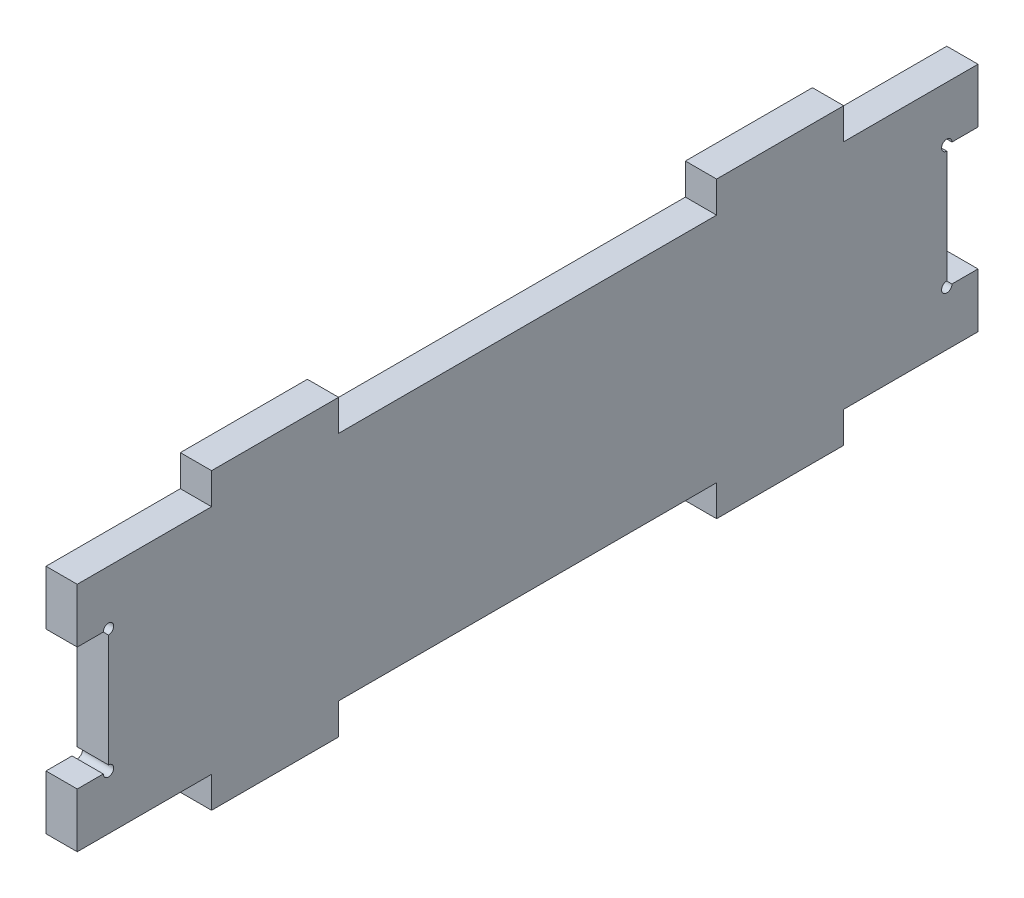
ISO-10303-21;
HEADER;
FILE_DESCRIPTION(('STEP AP214'),'2;1');
FILE_NAME('part.step','',(''),(''),'','','');
FILE_SCHEMA(('AUTOMOTIVE_DESIGN { 1 0 10303 214 1 1 1 1 }'));
ENDSEC;
DATA;
#1=APPLICATION_CONTEXT('core data for automotive mechanical design processes');
#2=APPLICATION_PROTOCOL_DEFINITION('international standard','automotive_design',2000,#1);
#3=PRODUCT_CONTEXT('',#1,'mechanical');
#4=PRODUCT('Part','Part','',(#3));
#5=PRODUCT_RELATED_PRODUCT_CATEGORY('part','',(#4));
#6=PRODUCT_DEFINITION_FORMATION('','',#4);
#7=PRODUCT_DEFINITION_CONTEXT('part definition',#1,'design');
#8=PRODUCT_DEFINITION('design','',#6,#7);
#9=PRODUCT_DEFINITION_SHAPE('','',#8);
#10=(LENGTH_UNIT() NAMED_UNIT(*) SI_UNIT(.MILLI.,.METRE.));
#11=(NAMED_UNIT(*) PLANE_ANGLE_UNIT() SI_UNIT($,.RADIAN.));
#12=(NAMED_UNIT(*) SI_UNIT($,.STERADIAN.) SOLID_ANGLE_UNIT());
#13=UNCERTAINTY_MEASURE_WITH_UNIT(LENGTH_MEASURE(1.E-05),#10,'distance_accuracy_value','');
#14=(GEOMETRIC_REPRESENTATION_CONTEXT(3) GLOBAL_UNCERTAINTY_ASSIGNED_CONTEXT((#13)) GLOBAL_UNIT_ASSIGNED_CONTEXT((#10,
#11,#12)) REPRESENTATION_CONTEXT('',''));
#15=CARTESIAN_POINT('',(0.,0.,0.));
#16=DIRECTION('',(0.,0.,1.));
#17=DIRECTION('',(1.,0.,0.));
#18=AXIS2_PLACEMENT_3D('',#15,#16,#17);
#19=CARTESIAN_POINT('',(3.,20.0947082124793,-0.14299932326039));
#20=DIRECTION('',(0.,1.,0.));
#21=DIRECTION('',(0.,0.,1.));
#22=AXIS2_PLACEMENT_3D('',#19,#20,#21);
#23=PLANE('',#22);
#24=DIRECTION('',(0.,0.,-1.));
#25=VECTOR('',#24,1.);
#26=CARTESIAN_POINT('',(0.,20.0947082124793,-0.14299932326039));
#27=LINE('',#26,#25);
#28=CARTESIAN_POINT('',(0.,20.0947082124793,-0.14299932326039));
#29=VERTEX_POINT('',#28);
#30=CARTESIAN_POINT('',(0.,20.0947082124793,-2.64299932326039));
#31=VERTEX_POINT('',#30);
#32=EDGE_CURVE('E272',#29,#31,#27,.T.);
#33=ORIENTED_EDGE('',*,*,#32,.T.);
#34=DIRECTION('',(-1.,0.,0.));
#35=VECTOR('',#34,1.);
#36=CARTESIAN_POINT('',(3.,20.0947082124793,-2.64299932326039));
#37=LINE('',#36,#35);
#38=CARTESIAN_POINT('',(3.,20.0947082124793,-2.64299932326039));
#39=VERTEX_POINT('',#38);
#40=EDGE_CURVE('E11',#39,#31,#37,.T.);
#41=ORIENTED_EDGE('',*,*,#40,.F.);
#42=DIRECTION('',(0.,0.,-1.));
#43=VECTOR('',#42,1.);
#44=CARTESIAN_POINT('',(3.,20.0947082124793,-0.14299932326039));
#45=LINE('',#44,#43);
#46=CARTESIAN_POINT('',(3.,20.0947082124793,-0.14299932326039));
#47=VERTEX_POINT('',#46);
#48=EDGE_CURVE('E334',#47,#39,#45,.T.);
#49=ORIENTED_EDGE('',*,*,#48,.F.);
#50=DIRECTION('',(-1.,0.,0.));
#51=VECTOR('',#50,1.);
#52=CARTESIAN_POINT('',(3.,20.0947082124793,-0.14299932326039));
#53=LINE('',#52,#51);
#54=EDGE_CURVE('E268',#47,#29,#53,.T.);
#55=ORIENTED_EDGE('',*,*,#54,.T.);
#56=EDGE_LOOP('',(#33,#41,#49,#55));
#57=FACE_BOUND('',#56,.T.);
#58=ADVANCED_FACE('F32',(#57),#23,.F.);
#59=CARTESIAN_POINT('',(3.,20.0947082124793,-3.14299932326039));
#60=DIRECTION('',(-1.,0.,0.));
#61=DIRECTION('',(0.,0.,1.));
#62=AXIS2_PLACEMENT_3D('',#59,#60,#61);
#63=CYLINDRICAL_SURFACE('',#62,0.5);
#64=CARTESIAN_POINT('',(0.,20.0947082124793,-3.14299932326039));
#65=DIRECTION('',(-1.,0.,0.));
#66=DIRECTION('',(0.,0.,-1.));
#67=AXIS2_PLACEMENT_3D('',#64,#65,#66);
#68=CIRCLE('',#67,0.5);
#69=CARTESIAN_POINT('',(0.,19.5947082124793,-3.14299932326039));
#70=VERTEX_POINT('',#69);
#71=EDGE_CURVE('E275',#31,#70,#68,.T.);
#72=ORIENTED_EDGE('',*,*,#71,.T.);
#73=DIRECTION('',(-1.,0.,0.));
#74=VECTOR('',#73,1.);
#75=CARTESIAN_POINT('',(3.,19.5947082124793,-3.14299932326039));
#76=LINE('',#75,#74);
#77=CARTESIAN_POINT('',(3.,19.5947082124793,-3.14299932326039));
#78=VERTEX_POINT('',#77);
#79=EDGE_CURVE('E40',#78,#70,#76,.T.);
#80=ORIENTED_EDGE('',*,*,#79,.F.);
#81=CARTESIAN_POINT('',(3.,20.0947082124793,-3.14299932326039));
#82=DIRECTION('',(-1.,0.,0.));
#83=DIRECTION('',(0.,0.,-1.));
#84=AXIS2_PLACEMENT_3D('',#81,#82,#83);
#85=CIRCLE('',#84,0.5);
#86=EDGE_CURVE('E163',#39,#78,#85,.T.);
#87=ORIENTED_EDGE('',*,*,#86,.F.);
#88=ORIENTED_EDGE('',*,*,#40,.T.);
#89=EDGE_LOOP('',(#72,#80,#87,#88));
#90=FACE_BOUND('',#89,.T.);
#91=ADVANCED_FACE('F512',(#90),#63,.F.);
#92=CARTESIAN_POINT('',(3.,19.5947082124793,-3.14299932326039));
#93=DIRECTION('',(0.,0.,-1.));
#94=DIRECTION('',(0.,1.,0.));
#95=AXIS2_PLACEMENT_3D('',#92,#93,#94);
#96=PLANE('',#95);
#97=DIRECTION('',(0.,-1.,0.));
#98=VECTOR('',#97,1.);
#99=CARTESIAN_POINT('',(0.,19.5947082124793,-3.14299932326039));
#100=LINE('',#99,#98);
#101=CARTESIAN_POINT('',(0.,8.79470821247926,-3.14299932326039));
#102=VERTEX_POINT('',#101);
#103=EDGE_CURVE('E277',#70,#102,#100,.T.);
#104=ORIENTED_EDGE('',*,*,#103,.T.);
#105=DIRECTION('',(-1.,0.,0.));
#106=VECTOR('',#105,1.);
#107=CARTESIAN_POINT('',(3.,8.79470821247926,-3.14299932326039));
#108=LINE('',#107,#106);
#109=CARTESIAN_POINT('',(3.,8.79470821247926,-3.14299932326039));
#110=VERTEX_POINT('',#109);
#111=EDGE_CURVE('E413',#110,#102,#108,.T.);
#112=ORIENTED_EDGE('',*,*,#111,.F.);
#113=DIRECTION('',(0.,-1.,0.));
#114=VECTOR('',#113,1.);
#115=CARTESIAN_POINT('',(3.,19.5947082124793,-3.14299932326039));
#116=LINE('',#115,#114);
#117=EDGE_CURVE('E421',#78,#110,#116,.T.);
#118=ORIENTED_EDGE('',*,*,#117,.F.);
#119=ORIENTED_EDGE('',*,*,#79,.T.);
#120=EDGE_LOOP('',(#104,#112,#118,#119));
#121=FACE_BOUND('',#120,.T.);
#122=ADVANCED_FACE('F419',(#121),#96,.F.);
#123=CARTESIAN_POINT('',(3.,8.29470821247925,-3.14299932326039));
#124=DIRECTION('',(-1.,0.,0.));
#125=DIRECTION('',(0.,0.,1.));
#126=AXIS2_PLACEMENT_3D('',#123,#124,#125);
#127=CYLINDRICAL_SURFACE('',#126,0.5);
#128=CARTESIAN_POINT('',(0.,8.29470821247925,-3.14299932326039));
#129=DIRECTION('',(-1.,0.,0.));
#130=DIRECTION('',(0.,0.,-1.));
#131=AXIS2_PLACEMENT_3D('',#128,#129,#130);
#132=CIRCLE('',#131,0.5);
#133=CARTESIAN_POINT('',(0.,8.29470821247925,-2.64299932326039));
#134=VERTEX_POINT('',#133);
#135=EDGE_CURVE('E279',#102,#134,#132,.T.);
#136=ORIENTED_EDGE('',*,*,#135,.T.);
#137=DIRECTION('',(-1.,0.,0.));
#138=VECTOR('',#137,1.);
#139=CARTESIAN_POINT('',(3.,8.29470821247925,-2.64299932326039));
#140=LINE('',#139,#138);
#141=CARTESIAN_POINT('',(3.,8.29470821247925,-2.64299932326039));
#142=VERTEX_POINT('',#141);
#143=EDGE_CURVE('E410',#142,#134,#140,.T.);
#144=ORIENTED_EDGE('',*,*,#143,.F.);
#145=CARTESIAN_POINT('',(3.,8.29470821247925,-3.14299932326039));
#146=DIRECTION('',(-1.,0.,0.));
#147=DIRECTION('',(0.,0.,-1.));
#148=AXIS2_PLACEMENT_3D('',#145,#146,#147);
#149=CIRCLE('',#148,0.5);
#150=EDGE_CURVE('E439',#110,#142,#149,.T.);
#151=ORIENTED_EDGE('',*,*,#150,.F.);
#152=ORIENTED_EDGE('',*,*,#111,.T.);
#153=EDGE_LOOP('',(#136,#144,#151,#152));
#154=FACE_BOUND('',#153,.T.);
#155=ADVANCED_FACE('F430',(#154),#127,.F.);
#156=CARTESIAN_POINT('',(3.,8.29470821247925,-0.14299932326039));
#157=DIRECTION('',(0.,-1.,0.));
#158=DIRECTION('',(0.,0.,-1.));
#159=AXIS2_PLACEMENT_3D('',#156,#157,#158);
#160=PLANE('',#159);
#161=DIRECTION('',(0.,0.,1.));
#162=VECTOR('',#161,1.);
#163=CARTESIAN_POINT('',(0.,8.29470821247925,-0.14299932326039));
#164=LINE('',#163,#162);
#165=CARTESIAN_POINT('',(0.,8.29470821247925,-0.14299932326039));
#166=VERTEX_POINT('',#165);
#167=EDGE_CURVE('E281',#134,#166,#164,.T.);
#168=ORIENTED_EDGE('',*,*,#167,.T.);
#169=DIRECTION('',(-1.,0.,0.));
#170=VECTOR('',#169,1.);
#171=CARTESIAN_POINT('',(3.,8.29470821247925,-0.14299932326039));
#172=LINE('',#171,#170);
#173=CARTESIAN_POINT('',(3.,8.29470821247925,-0.14299932326039));
#174=VERTEX_POINT('',#173);
#175=EDGE_CURVE('E407',#174,#166,#172,.T.);
#176=ORIENTED_EDGE('',*,*,#175,.F.);
#177=DIRECTION('',(0.,0.,1.));
#178=VECTOR('',#177,1.);
#179=CARTESIAN_POINT('',(3.,8.29470821247925,-0.14299932326039));
#180=LINE('',#179,#178);
#181=EDGE_CURVE('E436',#142,#174,#180,.T.);
#182=ORIENTED_EDGE('',*,*,#181,.F.);
#183=ORIENTED_EDGE('',*,*,#143,.T.);
#184=EDGE_LOOP('',(#168,#176,#182,#183));
#185=FACE_BOUND('',#184,.T.);
#186=ADVANCED_FACE('F434',(#185),#160,.F.);
#187=CARTESIAN_POINT('',(3.,3.06970821247926,-0.14299932326039));
#188=DIRECTION('',(0.,0.,-1.));
#189=DIRECTION('',(-1.,0.,0.));
#190=AXIS2_PLACEMENT_3D('',#187,#188,#189);
#191=PLANE('',#190);
#192=DIRECTION('',(0.,-1.,0.));
#193=VECTOR('',#192,1.);
#194=CARTESIAN_POINT('',(0.,3.06970821247926,-0.14299932326039));
#195=LINE('',#194,#193);
#196=CARTESIAN_POINT('',(0.,3.06970821247926,-0.14299932326039));
#197=VERTEX_POINT('',#196);
#198=EDGE_CURVE('E283',#166,#197,#195,.T.);
#199=ORIENTED_EDGE('',*,*,#198,.T.);
#200=DIRECTION('',(-1.,0.,0.));
#201=VECTOR('',#200,1.);
#202=CARTESIAN_POINT('',(3.,3.06970821247926,-0.14299932326039));
#203=LINE('',#202,#201);
#204=CARTESIAN_POINT('',(3.,3.06970821247926,-0.14299932326039));
#205=VERTEX_POINT('',#204);
#206=EDGE_CURVE('E404',#205,#197,#203,.T.);
#207=ORIENTED_EDGE('',*,*,#206,.F.);
#208=DIRECTION('',(0.,-1.,0.));
#209=VECTOR('',#208,1.);
#210=CARTESIAN_POINT('',(3.,3.06970821247926,-0.14299932326039));
#211=LINE('',#210,#209);
#212=EDGE_CURVE('E438',#174,#205,#211,.T.);
#213=ORIENTED_EDGE('',*,*,#212,.F.);
#214=ORIENTED_EDGE('',*,*,#175,.T.);
#215=EDGE_LOOP('',(#199,#207,#213,#214));
#216=FACE_BOUND('',#215,.T.);
#217=ADVANCED_FACE('F525',(#216),#191,.F.);
#218=CARTESIAN_POINT('',(3.,3.06970821247926,-0.14299932326039));
#219=DIRECTION('',(0.,1.,0.));
#220=DIRECTION('',(0.,0.,1.));
#221=AXIS2_PLACEMENT_3D('',#218,#219,#220);
#222=PLANE('',#221);
#223=DIRECTION('',(0.,0.,-1.));
#224=VECTOR('',#223,1.);
#225=CARTESIAN_POINT('',(0.,3.06970821247926,-0.14299932326039));
#226=LINE('',#225,#224);
#227=CARTESIAN_POINT('',(0.,3.06970821247926,-13.0429993232604));
#228=VERTEX_POINT('',#227);
#229=EDGE_CURVE('E285',#197,#228,#226,.T.);
#230=ORIENTED_EDGE('',*,*,#229,.T.);
#231=DIRECTION('',(-1.,0.,0.));
#232=VECTOR('',#231,1.);
#233=CARTESIAN_POINT('',(3.,3.06970821247926,-13.0429993232604));
#234=LINE('',#233,#232);
#235=CARTESIAN_POINT('',(3.,3.06970821247926,-13.0429993232604));
#236=VERTEX_POINT('',#235);
#237=EDGE_CURVE('E401',#236,#228,#234,.T.);
#238=ORIENTED_EDGE('',*,*,#237,.F.);
#239=DIRECTION('',(0.,0.,-1.));
#240=VECTOR('',#239,1.);
#241=CARTESIAN_POINT('',(3.,3.06970821247926,-0.14299932326039));
#242=LINE('',#241,#240);
#243=EDGE_CURVE('E441',#205,#236,#242,.T.);
#244=ORIENTED_EDGE('',*,*,#243,.F.);
#245=ORIENTED_EDGE('',*,*,#206,.T.);
#246=EDGE_LOOP('',(#230,#238,#244,#245));
#247=FACE_BOUND('',#246,.T.);
#248=ADVANCED_FACE('F528',(#247),#222,.F.);
#249=CARTESIAN_POINT('',(3.,3.06970821247926,-13.0429993232604));
#250=DIRECTION('',(0.,0.,-1.));
#251=DIRECTION('',(-1.,0.,0.));
#252=AXIS2_PLACEMENT_3D('',#249,#250,#251);
#253=PLANE('',#252);
#254=DIRECTION('',(0.,-1.,0.));
#255=VECTOR('',#254,1.);
#256=CARTESIAN_POINT('',(0.,3.06970821247926,-13.0429993232604));
#257=LINE('',#256,#255);
#258=CARTESIAN_POINT('',(0.,0.0697082124792581,-13.0429993232604));
#259=VERTEX_POINT('',#258);
#260=EDGE_CURVE('E287',#228,#259,#257,.T.);
#261=ORIENTED_EDGE('',*,*,#260,.T.);
#262=DIRECTION('',(-1.,0.,0.));
#263=VECTOR('',#262,1.);
#264=CARTESIAN_POINT('',(3.,0.0697082124792581,-13.0429993232604));
#265=LINE('',#264,#263);
#266=CARTESIAN_POINT('',(3.,0.0697082124792581,-13.0429993232604));
#267=VERTEX_POINT('',#266);
#268=EDGE_CURVE('E398',#267,#259,#265,.T.);
#269=ORIENTED_EDGE('',*,*,#268,.F.);
#270=DIRECTION('',(0.,-1.,0.));
#271=VECTOR('',#270,1.);
#272=CARTESIAN_POINT('',(3.,3.06970821247926,-13.0429993232604));
#273=LINE('',#272,#271);
#274=EDGE_CURVE('E447',#236,#267,#273,.T.);
#275=ORIENTED_EDGE('',*,*,#274,.F.);
#276=ORIENTED_EDGE('',*,*,#237,.T.);
#277=EDGE_LOOP('',(#261,#269,#275,#276));
#278=FACE_BOUND('',#277,.T.);
#279=ADVANCED_FACE('F532',(#278),#253,.F.);
#280=CARTESIAN_POINT('',(3.,0.0697082124792581,-13.0429993232604));
#281=DIRECTION('',(0.,1.,0.));
#282=DIRECTION('',(0.,0.,1.));
#283=AXIS2_PLACEMENT_3D('',#280,#281,#282);
#284=PLANE('',#283);
#285=DIRECTION('',(0.,0.,-1.));
#286=VECTOR('',#285,1.);
#287=CARTESIAN_POINT('',(0.,0.0697082124792581,-13.0429993232604));
#288=LINE('',#287,#286);
#289=CARTESIAN_POINT('',(0.,0.069708212479258,-25.2429993232604));
#290=VERTEX_POINT('',#289);
#291=EDGE_CURVE('E289',#259,#290,#288,.T.);
#292=ORIENTED_EDGE('',*,*,#291,.T.);
#293=DIRECTION('',(-1.,0.,0.));
#294=VECTOR('',#293,1.);
#295=CARTESIAN_POINT('',(3.,0.069708212479258,-25.2429993232604));
#296=LINE('',#295,#294);
#297=CARTESIAN_POINT('',(3.,0.069708212479258,-25.2429993232604));
#298=VERTEX_POINT('',#297);
#299=EDGE_CURVE('E395',#298,#290,#296,.T.);
#300=ORIENTED_EDGE('',*,*,#299,.F.);
#301=DIRECTION('',(0.,0.,-1.));
#302=VECTOR('',#301,1.);
#303=CARTESIAN_POINT('',(3.,0.0697082124792581,-13.0429993232604));
#304=LINE('',#303,#302);
#305=EDGE_CURVE('E449',#267,#298,#304,.T.);
#306=ORIENTED_EDGE('',*,*,#305,.F.);
#307=ORIENTED_EDGE('',*,*,#268,.T.);
#308=EDGE_LOOP('',(#292,#300,#306,#307));
#309=FACE_BOUND('',#308,.T.);
#310=ADVANCED_FACE('F536',(#309),#284,.F.);
#311=CARTESIAN_POINT('',(3.,3.06970821247926,-25.2429993232604));
#312=DIRECTION('',(0.,0.,1.));
#313=DIRECTION('',(1.,0.,0.));
#314=AXIS2_PLACEMENT_3D('',#311,#312,#313);
#315=PLANE('',#314);
#316=DIRECTION('',(0.,1.,0.));
#317=VECTOR('',#316,1.);
#318=CARTESIAN_POINT('',(0.,3.06970821247926,-25.2429993232604));
#319=LINE('',#318,#317);
#320=CARTESIAN_POINT('',(0.,3.06970821247926,-25.2429993232604));
#321=VERTEX_POINT('',#320);
#322=EDGE_CURVE('E291',#290,#321,#319,.T.);
#323=ORIENTED_EDGE('',*,*,#322,.T.);
#324=DIRECTION('',(-1.,0.,0.));
#325=VECTOR('',#324,1.);
#326=CARTESIAN_POINT('',(3.,3.06970821247926,-25.2429993232604));
#327=LINE('',#326,#325);
#328=CARTESIAN_POINT('',(3.,3.06970821247926,-25.2429993232604));
#329=VERTEX_POINT('',#328);
#330=EDGE_CURVE('E392',#329,#321,#327,.T.);
#331=ORIENTED_EDGE('',*,*,#330,.F.);
#332=DIRECTION('',(0.,1.,0.));
#333=VECTOR('',#332,1.);
#334=CARTESIAN_POINT('',(3.,3.06970821247926,-25.2429993232604));
#335=LINE('',#334,#333);
#336=EDGE_CURVE('E451',#298,#329,#335,.T.);
#337=ORIENTED_EDGE('',*,*,#336,.F.);
#338=ORIENTED_EDGE('',*,*,#299,.T.);
#339=EDGE_LOOP('',(#323,#331,#337,#338));
#340=FACE_BOUND('',#339,.T.);
#341=ADVANCED_FACE('F540',(#340),#315,.F.);
#342=CARTESIAN_POINT('',(3.,3.06970821247926,-25.2429993232604));
#343=DIRECTION('',(0.,1.,0.));
#344=DIRECTION('',(0.,0.,1.));
#345=AXIS2_PLACEMENT_3D('',#342,#343,#344);
#346=PLANE('',#345);
#347=DIRECTION('',(0.,0.,-1.));
#348=VECTOR('',#347,1.);
#349=CARTESIAN_POINT('',(0.,3.06970821247926,-25.2429993232604));
#350=LINE('',#349,#348);
#351=CARTESIAN_POINT('',(0.,3.06970821247926,-61.5429993232604));
#352=VERTEX_POINT('',#351);
#353=EDGE_CURVE('E293',#321,#352,#350,.T.);
#354=ORIENTED_EDGE('',*,*,#353,.T.);
#355=DIRECTION('',(-1.,0.,0.));
#356=VECTOR('',#355,1.);
#357=CARTESIAN_POINT('',(3.,3.06970821247926,-61.5429993232604));
#358=LINE('',#357,#356);
#359=CARTESIAN_POINT('',(3.,3.06970821247926,-61.5429993232604));
#360=VERTEX_POINT('',#359);
#361=EDGE_CURVE('E389',#360,#352,#358,.T.);
#362=ORIENTED_EDGE('',*,*,#361,.F.);
#363=DIRECTION('',(0.,0.,-1.));
#364=VECTOR('',#363,1.);
#365=CARTESIAN_POINT('',(3.,3.06970821247926,-25.2429993232604));
#366=LINE('',#365,#364);
#367=EDGE_CURVE('E453',#329,#360,#366,.T.);
#368=ORIENTED_EDGE('',*,*,#367,.F.);
#369=ORIENTED_EDGE('',*,*,#330,.T.);
#370=EDGE_LOOP('',(#354,#362,#368,#369));
#371=FACE_BOUND('',#370,.T.);
#372=ADVANCED_FACE('F544',(#371),#346,.F.);
#373=CARTESIAN_POINT('',(3.,3.06970821247926,-61.5429993232604));
#374=DIRECTION('',(0.,0.,-1.));
#375=DIRECTION('',(-1.,0.,0.));
#376=AXIS2_PLACEMENT_3D('',#373,#374,#375);
#377=PLANE('',#376);
#378=DIRECTION('',(0.,-1.,0.));
#379=VECTOR('',#378,1.);
#380=CARTESIAN_POINT('',(0.,3.06970821247926,-61.5429993232604));
#381=LINE('',#380,#379);
#382=CARTESIAN_POINT('',(0.,0.0697082124792581,-61.5429993232604));
#383=VERTEX_POINT('',#382);
#384=EDGE_CURVE('E295',#352,#383,#381,.T.);
#385=ORIENTED_EDGE('',*,*,#384,.T.);
#386=DIRECTION('',(-1.,0.,0.));
#387=VECTOR('',#386,1.);
#388=CARTESIAN_POINT('',(3.,0.0697082124792581,-61.5429993232604));
#389=LINE('',#388,#387);
#390=CARTESIAN_POINT('',(3.,0.0697082124792581,-61.5429993232604));
#391=VERTEX_POINT('',#390);
#392=EDGE_CURVE('E386',#391,#383,#389,.T.);
#393=ORIENTED_EDGE('',*,*,#392,.F.);
#394=DIRECTION('',(0.,-1.,0.));
#395=VECTOR('',#394,1.);
#396=CARTESIAN_POINT('',(3.,3.06970821247926,-61.5429993232604));
#397=LINE('',#396,#395);
#398=EDGE_CURVE('E455',#360,#391,#397,.T.);
#399=ORIENTED_EDGE('',*,*,#398,.F.);
#400=ORIENTED_EDGE('',*,*,#361,.T.);
#401=EDGE_LOOP('',(#385,#393,#399,#400));
#402=FACE_BOUND('',#401,.T.);
#403=ADVANCED_FACE('F548',(#402),#377,.F.);
#404=CARTESIAN_POINT('',(3.,0.0697082124792581,-61.5429993232604));
#405=DIRECTION('',(0.,1.,0.));
#406=DIRECTION('',(0.,0.,1.));
#407=AXIS2_PLACEMENT_3D('',#404,#405,#406);
#408=PLANE('',#407);
#409=DIRECTION('',(0.,0.,-1.));
#410=VECTOR('',#409,1.);
#411=CARTESIAN_POINT('',(0.,0.0697082124792581,-61.5429993232604));
#412=LINE('',#411,#410);
#413=CARTESIAN_POINT('',(0.,0.0697082124792581,-73.7429993232604));
#414=VERTEX_POINT('',#413);
#415=EDGE_CURVE('E297',#383,#414,#412,.T.);
#416=ORIENTED_EDGE('',*,*,#415,.T.);
#417=DIRECTION('',(-1.,0.,0.));
#418=VECTOR('',#417,1.);
#419=CARTESIAN_POINT('',(3.,0.0697082124792581,-73.7429993232604));
#420=LINE('',#419,#418);
#421=CARTESIAN_POINT('',(3.,0.0697082124792581,-73.7429993232604));
#422=VERTEX_POINT('',#421);
#423=EDGE_CURVE('E383',#422,#414,#420,.T.);
#424=ORIENTED_EDGE('',*,*,#423,.F.);
#425=DIRECTION('',(0.,0.,-1.));
#426=VECTOR('',#425,1.);
#427=CARTESIAN_POINT('',(3.,0.0697082124792581,-61.5429993232604));
#428=LINE('',#427,#426);
#429=EDGE_CURVE('E457',#391,#422,#428,.T.);
#430=ORIENTED_EDGE('',*,*,#429,.F.);
#431=ORIENTED_EDGE('',*,*,#392,.T.);
#432=EDGE_LOOP('',(#416,#424,#430,#431));
#433=FACE_BOUND('',#432,.T.);
#434=ADVANCED_FACE('F552',(#433),#408,.F.);
#435=CARTESIAN_POINT('',(3.,3.06970821247926,-73.7429993232604));
#436=DIRECTION('',(0.,0.,1.));
#437=DIRECTION('',(1.,0.,0.));
#438=AXIS2_PLACEMENT_3D('',#435,#436,#437);
#439=PLANE('',#438);
#440=DIRECTION('',(0.,1.,0.));
#441=VECTOR('',#440,1.);
#442=CARTESIAN_POINT('',(0.,3.06970821247926,-73.7429993232604));
#443=LINE('',#442,#441);
#444=CARTESIAN_POINT('',(0.,3.06970821247926,-73.7429993232604));
#445=VERTEX_POINT('',#444);
#446=EDGE_CURVE('E299',#414,#445,#443,.T.);
#447=ORIENTED_EDGE('',*,*,#446,.T.);
#448=DIRECTION('',(-1.,0.,0.));
#449=VECTOR('',#448,1.);
#450=CARTESIAN_POINT('',(3.,3.06970821247926,-73.7429993232604));
#451=LINE('',#450,#449);
#452=CARTESIAN_POINT('',(3.,3.06970821247926,-73.7429993232604));
#453=VERTEX_POINT('',#452);
#454=EDGE_CURVE('E380',#453,#445,#451,.T.);
#455=ORIENTED_EDGE('',*,*,#454,.F.);
#456=DIRECTION('',(0.,1.,0.));
#457=VECTOR('',#456,1.);
#458=CARTESIAN_POINT('',(3.,3.06970821247926,-73.7429993232604));
#459=LINE('',#458,#457);
#460=EDGE_CURVE('E459',#422,#453,#459,.T.);
#461=ORIENTED_EDGE('',*,*,#460,.F.);
#462=ORIENTED_EDGE('',*,*,#423,.T.);
#463=EDGE_LOOP('',(#447,#455,#461,#462));
#464=FACE_BOUND('',#463,.T.);
#465=ADVANCED_FACE('F556',(#464),#439,.F.);
#466=CARTESIAN_POINT('',(3.,3.06970821247926,-73.7429993232604));
#467=DIRECTION('',(0.,1.,0.));
#468=DIRECTION('',(0.,0.,1.));
#469=AXIS2_PLACEMENT_3D('',#466,#467,#468);
#470=PLANE('',#469);
#471=DIRECTION('',(0.,0.,-1.));
#472=VECTOR('',#471,1.);
#473=CARTESIAN_POINT('',(0.,3.06970821247926,-73.7429993232604));
#474=LINE('',#473,#472);
#475=CARTESIAN_POINT('',(0.,3.06970821247926,-86.6429993232604));
#476=VERTEX_POINT('',#475);
#477=EDGE_CURVE('E301',#445,#476,#474,.T.);
#478=ORIENTED_EDGE('',*,*,#477,.T.);
#479=DIRECTION('',(-1.,0.,0.));
#480=VECTOR('',#479,1.);
#481=CARTESIAN_POINT('',(3.,3.06970821247926,-86.6429993232604));
#482=LINE('',#481,#480);
#483=CARTESIAN_POINT('',(3.,3.06970821247926,-86.6429993232604));
#484=VERTEX_POINT('',#483);
#485=EDGE_CURVE('E377',#484,#476,#482,.T.);
#486=ORIENTED_EDGE('',*,*,#485,.F.);
#487=DIRECTION('',(0.,0.,-1.));
#488=VECTOR('',#487,1.);
#489=CARTESIAN_POINT('',(3.,3.06970821247926,-73.7429993232604));
#490=LINE('',#489,#488);
#491=EDGE_CURVE('E461',#453,#484,#490,.T.);
#492=ORIENTED_EDGE('',*,*,#491,.F.);
#493=ORIENTED_EDGE('',*,*,#454,.T.);
#494=EDGE_LOOP('',(#478,#486,#492,#493));
#495=FACE_BOUND('',#494,.T.);
#496=ADVANCED_FACE('F560',(#495),#470,.F.);
#497=CARTESIAN_POINT('',(3.,3.06970821247926,-86.6429993232604));
#498=DIRECTION('',(0.,0.,1.));
#499=DIRECTION('',(1.,0.,0.));
#500=AXIS2_PLACEMENT_3D('',#497,#498,#499);
#501=PLANE('',#500);
#502=DIRECTION('',(0.,1.,0.));
#503=VECTOR('',#502,1.);
#504=CARTESIAN_POINT('',(0.,3.06970821247926,-86.6429993232604));
#505=LINE('',#504,#503);
#506=CARTESIAN_POINT('',(0.,8.29470821247925,-86.6429993232604));
#507=VERTEX_POINT('',#506);
#508=EDGE_CURVE('E303',#476,#507,#505,.T.);
#509=ORIENTED_EDGE('',*,*,#508,.T.);
#510=DIRECTION('',(-1.,0.,0.));
#511=VECTOR('',#510,1.);
#512=CARTESIAN_POINT('',(3.,8.29470821247925,-86.6429993232604));
#513=LINE('',#512,#511);
#514=CARTESIAN_POINT('',(3.,8.29470821247925,-86.6429993232604));
#515=VERTEX_POINT('',#514);
#516=EDGE_CURVE('E374',#515,#507,#513,.T.);
#517=ORIENTED_EDGE('',*,*,#516,.F.);
#518=DIRECTION('',(0.,1.,0.));
#519=VECTOR('',#518,1.);
#520=CARTESIAN_POINT('',(3.,3.06970821247926,-86.6429993232604));
#521=LINE('',#520,#519);
#522=EDGE_CURVE('E463',#484,#515,#521,.T.);
#523=ORIENTED_EDGE('',*,*,#522,.F.);
#524=ORIENTED_EDGE('',*,*,#485,.T.);
#525=EDGE_LOOP('',(#509,#517,#523,#524));
#526=FACE_BOUND('',#525,.T.);
#527=ADVANCED_FACE('F564',(#526),#501,.F.);
#528=CARTESIAN_POINT('',(3.,8.29470821247925,-86.6429993232604));
#529=DIRECTION('',(0.,-1.,0.));
#530=DIRECTION('',(0.,0.,-1.));
#531=AXIS2_PLACEMENT_3D('',#528,#529,#530);
#532=PLANE('',#531);
#533=DIRECTION('',(0.,0.,1.));
#534=VECTOR('',#533,1.);
#535=CARTESIAN_POINT('',(0.,8.29470821247925,-86.6429993232604));
#536=LINE('',#535,#534);
#537=CARTESIAN_POINT('',(0.,8.29470821247925,-84.1429993232604));
#538=VERTEX_POINT('',#537);
#539=EDGE_CURVE('E305',#507,#538,#536,.T.);
#540=ORIENTED_EDGE('',*,*,#539,.T.);
#541=DIRECTION('',(-1.,0.,0.));
#542=VECTOR('',#541,1.);
#543=CARTESIAN_POINT('',(3.,8.29470821247925,-84.1429993232604));
#544=LINE('',#543,#542);
#545=CARTESIAN_POINT('',(3.,8.29470821247925,-84.1429993232604));
#546=VERTEX_POINT('',#545);
#547=EDGE_CURVE('E371',#546,#538,#544,.T.);
#548=ORIENTED_EDGE('',*,*,#547,.F.);
#549=DIRECTION('',(0.,0.,1.));
#550=VECTOR('',#549,1.);
#551=CARTESIAN_POINT('',(3.,8.29470821247925,-86.6429993232604));
#552=LINE('',#551,#550);
#553=EDGE_CURVE('E465',#515,#546,#552,.T.);
#554=ORIENTED_EDGE('',*,*,#553,.F.);
#555=ORIENTED_EDGE('',*,*,#516,.T.);
#556=EDGE_LOOP('',(#540,#548,#554,#555));
#557=FACE_BOUND('',#556,.T.);
#558=ADVANCED_FACE('F568',(#557),#532,.F.);
#559=CARTESIAN_POINT('',(3.,8.29470821247925,-83.6429993232604));
#560=DIRECTION('',(-1.,0.,0.));
#561=DIRECTION('',(0.,0.,1.));
#562=AXIS2_PLACEMENT_3D('',#559,#560,#561);
#563=CYLINDRICAL_SURFACE('',#562,0.5);
#564=CARTESIAN_POINT('',(0.,8.29470821247925,-83.6429993232604));
#565=DIRECTION('',(-1.,0.,0.));
#566=DIRECTION('',(0.,0.,-1.));
#567=AXIS2_PLACEMENT_3D('',#564,#565,#566);
#568=CIRCLE('',#567,0.5);
#569=CARTESIAN_POINT('',(0.,8.79470821247925,-83.6429993232604));
#570=VERTEX_POINT('',#569);
#571=EDGE_CURVE('E307',#538,#570,#568,.T.);
#572=ORIENTED_EDGE('',*,*,#571,.T.);
#573=DIRECTION('',(-1.,0.,0.));
#574=VECTOR('',#573,1.);
#575=CARTESIAN_POINT('',(3.,8.79470821247925,-83.6429993232604));
#576=LINE('',#575,#574);
#577=CARTESIAN_POINT('',(3.,8.79470821247925,-83.6429993232604));
#578=VERTEX_POINT('',#577);
#579=EDGE_CURVE('E368',#578,#570,#576,.T.);
#580=ORIENTED_EDGE('',*,*,#579,.F.);
#581=CARTESIAN_POINT('',(3.,8.29470821247925,-83.6429993232604));
#582=DIRECTION('',(-1.,0.,0.));
#583=DIRECTION('',(0.,0.,-1.));
#584=AXIS2_PLACEMENT_3D('',#581,#582,#583);
#585=CIRCLE('',#584,0.5);
#586=EDGE_CURVE('E467',#546,#578,#585,.T.);
#587=ORIENTED_EDGE('',*,*,#586,.F.);
#588=ORIENTED_EDGE('',*,*,#547,.T.);
#589=EDGE_LOOP('',(#572,#580,#587,#588));
#590=FACE_BOUND('',#589,.T.);
#591=ADVANCED_FACE('F572',(#590),#563,.F.);
#592=CARTESIAN_POINT('',(3.,19.5947082124793,-83.6429993232604));
#593=DIRECTION('',(0.,0.,1.));
#594=DIRECTION('',(1.,0.,0.));
#595=AXIS2_PLACEMENT_3D('',#592,#593,#594);
#596=PLANE('',#595);
#597=DIRECTION('',(0.,1.,0.));
#598=VECTOR('',#597,1.);
#599=CARTESIAN_POINT('',(0.,19.5947082124793,-83.6429993232604));
#600=LINE('',#599,#598);
#601=CARTESIAN_POINT('',(0.,19.5947082124793,-83.6429993232604));
#602=VERTEX_POINT('',#601);
#603=EDGE_CURVE('E309',#570,#602,#600,.T.);
#604=ORIENTED_EDGE('',*,*,#603,.T.);
#605=DIRECTION('',(-1.,0.,0.));
#606=VECTOR('',#605,1.);
#607=CARTESIAN_POINT('',(3.,19.5947082124793,-83.6429993232604));
#608=LINE('',#607,#606);
#609=CARTESIAN_POINT('',(3.,19.5947082124793,-83.6429993232604));
#610=VERTEX_POINT('',#609);
#611=EDGE_CURVE('E365',#610,#602,#608,.T.);
#612=ORIENTED_EDGE('',*,*,#611,.F.);
#613=DIRECTION('',(0.,1.,0.));
#614=VECTOR('',#613,1.);
#615=CARTESIAN_POINT('',(3.,19.5947082124793,-83.6429993232604));
#616=LINE('',#615,#614);
#617=EDGE_CURVE('E469',#578,#610,#616,.T.);
#618=ORIENTED_EDGE('',*,*,#617,.F.);
#619=ORIENTED_EDGE('',*,*,#579,.T.);
#620=EDGE_LOOP('',(#604,#612,#618,#619));
#621=FACE_BOUND('',#620,.T.);
#622=ADVANCED_FACE('F576',(#621),#596,.F.);
#623=CARTESIAN_POINT('',(3.,20.0947082124793,-83.6429993232604));
#624=DIRECTION('',(-1.,0.,0.));
#625=DIRECTION('',(0.,0.,1.));
#626=AXIS2_PLACEMENT_3D('',#623,#624,#625);
#627=CYLINDRICAL_SURFACE('',#626,0.5);
#628=CARTESIAN_POINT('',(0.,20.0947082124793,-83.6429993232604));
#629=DIRECTION('',(-1.,0.,0.));
#630=DIRECTION('',(0.,0.,-1.));
#631=AXIS2_PLACEMENT_3D('',#628,#629,#630);
#632=CIRCLE('',#631,0.5);
#633=CARTESIAN_POINT('',(0.,20.0947082124793,-84.1429993232604));
#634=VERTEX_POINT('',#633);
#635=EDGE_CURVE('E311',#602,#634,#632,.T.);
#636=ORIENTED_EDGE('',*,*,#635,.T.);
#637=DIRECTION('',(-1.,0.,0.));
#638=VECTOR('',#637,1.);
#639=CARTESIAN_POINT('',(3.,20.0947082124793,-84.1429993232604));
#640=LINE('',#639,#638);
#641=CARTESIAN_POINT('',(3.,20.0947082124793,-84.1429993232604));
#642=VERTEX_POINT('',#641);
#643=EDGE_CURVE('E362',#642,#634,#640,.T.);
#644=ORIENTED_EDGE('',*,*,#643,.F.);
#645=CARTESIAN_POINT('',(3.,20.0947082124793,-83.6429993232604));
#646=DIRECTION('',(-1.,0.,0.));
#647=DIRECTION('',(0.,0.,-1.));
#648=AXIS2_PLACEMENT_3D('',#645,#646,#647);
#649=CIRCLE('',#648,0.5);
#650=EDGE_CURVE('E471',#610,#642,#649,.T.);
#651=ORIENTED_EDGE('',*,*,#650,.F.);
#652=ORIENTED_EDGE('',*,*,#611,.T.);
#653=EDGE_LOOP('',(#636,#644,#651,#652));
#654=FACE_BOUND('',#653,.T.);
#655=ADVANCED_FACE('F580',(#654),#627,.F.);
#656=CARTESIAN_POINT('',(3.,20.0947082124793,-86.6429993232604));
#657=DIRECTION('',(0.,1.,0.));
#658=DIRECTION('',(0.,0.,1.));
#659=AXIS2_PLACEMENT_3D('',#656,#657,#658);
#660=PLANE('',#659);
#661=DIRECTION('',(0.,0.,-1.));
#662=VECTOR('',#661,1.);
#663=CARTESIAN_POINT('',(0.,20.0947082124793,-86.6429993232604));
#664=LINE('',#663,#662);
#665=CARTESIAN_POINT('',(0.,20.0947082124793,-86.6429993232604));
#666=VERTEX_POINT('',#665);
#667=EDGE_CURVE('E313',#634,#666,#664,.T.);
#668=ORIENTED_EDGE('',*,*,#667,.T.);
#669=DIRECTION('',(-1.,0.,0.));
#670=VECTOR('',#669,1.);
#671=CARTESIAN_POINT('',(3.,20.0947082124793,-86.6429993232604));
#672=LINE('',#671,#670);
#673=CARTESIAN_POINT('',(3.,20.0947082124793,-86.6429993232604));
#674=VERTEX_POINT('',#673);
#675=EDGE_CURVE('E359',#674,#666,#672,.T.);
#676=ORIENTED_EDGE('',*,*,#675,.F.);
#677=DIRECTION('',(0.,0.,-1.));
#678=VECTOR('',#677,1.);
#679=CARTESIAN_POINT('',(3.,20.0947082124793,-86.6429993232604));
#680=LINE('',#679,#678);
#681=EDGE_CURVE('E473',#642,#674,#680,.T.);
#682=ORIENTED_EDGE('',*,*,#681,.F.);
#683=ORIENTED_EDGE('',*,*,#643,.T.);
#684=EDGE_LOOP('',(#668,#676,#682,#683));
#685=FACE_BOUND('',#684,.T.);
#686=ADVANCED_FACE('F584',(#685),#660,.F.);
#687=CARTESIAN_POINT('',(3.,20.0947082124793,-86.6429993232604));
#688=DIRECTION('',(0.,0.,1.));
#689=DIRECTION('',(1.,0.,0.));
#690=AXIS2_PLACEMENT_3D('',#687,#688,#689);
#691=PLANE('',#690);
#692=DIRECTION('',(0.,1.,0.));
#693=VECTOR('',#692,1.);
#694=CARTESIAN_POINT('',(0.,20.0947082124793,-86.6429993232604));
#695=LINE('',#694,#693);
#696=CARTESIAN_POINT('',(0.,25.3197082124793,-86.6429993232604));
#697=VERTEX_POINT('',#696);
#698=EDGE_CURVE('E315',#666,#697,#695,.T.);
#699=ORIENTED_EDGE('',*,*,#698,.T.);
#700=DIRECTION('',(-1.,0.,0.));
#701=VECTOR('',#700,1.);
#702=CARTESIAN_POINT('',(3.,25.3197082124793,-86.6429993232604));
#703=LINE('',#702,#701);
#704=CARTESIAN_POINT('',(3.,25.3197082124793,-86.6429993232604));
#705=VERTEX_POINT('',#704);
#706=EDGE_CURVE('E356',#705,#697,#703,.T.);
#707=ORIENTED_EDGE('',*,*,#706,.F.);
#708=DIRECTION('',(0.,1.,0.));
#709=VECTOR('',#708,1.);
#710=CARTESIAN_POINT('',(3.,20.0947082124793,-86.6429993232604));
#711=LINE('',#710,#709);
#712=EDGE_CURVE('E475',#674,#705,#711,.T.);
#713=ORIENTED_EDGE('',*,*,#712,.F.);
#714=ORIENTED_EDGE('',*,*,#675,.T.);
#715=EDGE_LOOP('',(#699,#707,#713,#714));
#716=FACE_BOUND('',#715,.T.);
#717=ADVANCED_FACE('F588',(#716),#691,.F.);
#718=CARTESIAN_POINT('',(3.,25.3197082124793,-73.7429993232604));
#719=DIRECTION('',(0.,-1.,0.));
#720=DIRECTION('',(0.,0.,-1.));
#721=AXIS2_PLACEMENT_3D('',#718,#719,#720);
#722=PLANE('',#721);
#723=DIRECTION('',(0.,0.,1.));
#724=VECTOR('',#723,1.);
#725=CARTESIAN_POINT('',(0.,25.3197082124793,-73.7429993232604));
#726=LINE('',#725,#724);
#727=CARTESIAN_POINT('',(0.,25.3197082124793,-73.7429993232604));
#728=VERTEX_POINT('',#727);
#729=EDGE_CURVE('E317',#697,#728,#726,.T.);
#730=ORIENTED_EDGE('',*,*,#729,.T.);
#731=DIRECTION('',(-1.,0.,0.));
#732=VECTOR('',#731,1.);
#733=CARTESIAN_POINT('',(3.,25.3197082124793,-73.7429993232604));
#734=LINE('',#733,#732);
#735=CARTESIAN_POINT('',(3.,25.3197082124793,-73.7429993232604));
#736=VERTEX_POINT('',#735);
#737=EDGE_CURVE('E353',#736,#728,#734,.T.);
#738=ORIENTED_EDGE('',*,*,#737,.F.);
#739=DIRECTION('',(0.,0.,1.));
#740=VECTOR('',#739,1.);
#741=CARTESIAN_POINT('',(3.,25.3197082124793,-73.7429993232604));
#742=LINE('',#741,#740);
#743=EDGE_CURVE('E477',#705,#736,#742,.T.);
#744=ORIENTED_EDGE('',*,*,#743,.F.);
#745=ORIENTED_EDGE('',*,*,#706,.T.);
#746=EDGE_LOOP('',(#730,#738,#744,#745));
#747=FACE_BOUND('',#746,.T.);
#748=ADVANCED_FACE('F592',(#747),#722,.F.);
#749=CARTESIAN_POINT('',(3.,28.3197082124793,-73.7429993232604));
#750=DIRECTION('',(0.,0.,1.));
#751=DIRECTION('',(1.,0.,0.));
#752=AXIS2_PLACEMENT_3D('',#749,#750,#751);
#753=PLANE('',#752);
#754=DIRECTION('',(0.,1.,0.));
#755=VECTOR('',#754,1.);
#756=CARTESIAN_POINT('',(0.,28.3197082124793,-73.7429993232604));
#757=LINE('',#756,#755);
#758=CARTESIAN_POINT('',(0.,28.3197082124793,-73.7429993232604));
#759=VERTEX_POINT('',#758);
#760=EDGE_CURVE('E319',#728,#759,#757,.T.);
#761=ORIENTED_EDGE('',*,*,#760,.T.);
#762=DIRECTION('',(-1.,0.,0.));
#763=VECTOR('',#762,1.);
#764=CARTESIAN_POINT('',(3.,28.3197082124793,-73.7429993232604));
#765=LINE('',#764,#763);
#766=CARTESIAN_POINT('',(3.,28.3197082124793,-73.7429993232604));
#767=VERTEX_POINT('',#766);
#768=EDGE_CURVE('E350',#767,#759,#765,.T.);
#769=ORIENTED_EDGE('',*,*,#768,.F.);
#770=DIRECTION('',(0.,1.,0.));
#771=VECTOR('',#770,1.);
#772=CARTESIAN_POINT('',(3.,28.3197082124793,-73.7429993232604));
#773=LINE('',#772,#771);
#774=EDGE_CURVE('E479',#736,#767,#773,.T.);
#775=ORIENTED_EDGE('',*,*,#774,.F.);
#776=ORIENTED_EDGE('',*,*,#737,.T.);
#777=EDGE_LOOP('',(#761,#769,#775,#776));
#778=FACE_BOUND('',#777,.T.);
#779=ADVANCED_FACE('F596',(#778),#753,.F.);
#780=CARTESIAN_POINT('',(3.,28.3197082124793,-61.5429993232604));
#781=DIRECTION('',(0.,-1.,0.));
#782=DIRECTION('',(0.,0.,-1.));
#783=AXIS2_PLACEMENT_3D('',#780,#781,#782);
#784=PLANE('',#783);
#785=DIRECTION('',(0.,0.,1.));
#786=VECTOR('',#785,1.);
#787=CARTESIAN_POINT('',(0.,28.3197082124793,-61.5429993232604));
#788=LINE('',#787,#786);
#789=CARTESIAN_POINT('',(0.,28.3197082124793,-61.5429993232604));
#790=VERTEX_POINT('',#789);
#791=EDGE_CURVE('E321',#759,#790,#788,.T.);
#792=ORIENTED_EDGE('',*,*,#791,.T.);
#793=DIRECTION('',(-1.,0.,0.));
#794=VECTOR('',#793,1.);
#795=CARTESIAN_POINT('',(3.,28.3197082124793,-61.5429993232604));
#796=LINE('',#795,#794);
#797=CARTESIAN_POINT('',(3.,28.3197082124793,-61.5429993232604));
#798=VERTEX_POINT('',#797);
#799=EDGE_CURVE('E347',#798,#790,#796,.T.);
#800=ORIENTED_EDGE('',*,*,#799,.F.);
#801=DIRECTION('',(0.,0.,1.));
#802=VECTOR('',#801,1.);
#803=CARTESIAN_POINT('',(3.,28.3197082124793,-61.5429993232604));
#804=LINE('',#803,#802);
#805=EDGE_CURVE('E481',#767,#798,#804,.T.);
#806=ORIENTED_EDGE('',*,*,#805,.F.);
#807=ORIENTED_EDGE('',*,*,#768,.T.);
#808=EDGE_LOOP('',(#792,#800,#806,#807));
#809=FACE_BOUND('',#808,.T.);
#810=ADVANCED_FACE('F600',(#809),#784,.F.);
#811=CARTESIAN_POINT('',(3.,28.3197082124793,-61.5429993232604));
#812=DIRECTION('',(0.,0.,-1.));
#813=DIRECTION('',(-1.,0.,0.));
#814=AXIS2_PLACEMENT_3D('',#811,#812,#813);
#815=PLANE('',#814);
#816=DIRECTION('',(0.,-1.,0.));
#817=VECTOR('',#816,1.);
#818=CARTESIAN_POINT('',(0.,28.3197082124793,-61.5429993232604));
#819=LINE('',#818,#817);
#820=CARTESIAN_POINT('',(0.,25.3197082124793,-61.5429993232604));
#821=VERTEX_POINT('',#820);
#822=EDGE_CURVE('E323',#790,#821,#819,.T.);
#823=ORIENTED_EDGE('',*,*,#822,.T.);
#824=DIRECTION('',(-1.,0.,0.));
#825=VECTOR('',#824,1.);
#826=CARTESIAN_POINT('',(3.,25.3197082124793,-61.5429993232604));
#827=LINE('',#826,#825);
#828=CARTESIAN_POINT('',(3.,25.3197082124793,-61.5429993232604));
#829=VERTEX_POINT('',#828);
#830=EDGE_CURVE('E344',#829,#821,#827,.T.);
#831=ORIENTED_EDGE('',*,*,#830,.F.);
#832=DIRECTION('',(0.,-1.,0.));
#833=VECTOR('',#832,1.);
#834=CARTESIAN_POINT('',(3.,28.3197082124793,-61.5429993232604));
#835=LINE('',#834,#833);
#836=EDGE_CURVE('E483',#798,#829,#835,.T.);
#837=ORIENTED_EDGE('',*,*,#836,.F.);
#838=ORIENTED_EDGE('',*,*,#799,.T.);
#839=EDGE_LOOP('',(#823,#831,#837,#838));
#840=FACE_BOUND('',#839,.T.);
#841=ADVANCED_FACE('F604',(#840),#815,.F.);
#842=CARTESIAN_POINT('',(3.,25.3197082124793,-25.2429993232604));
#843=DIRECTION('',(0.,-1.,0.));
#844=DIRECTION('',(0.,0.,-1.));
#845=AXIS2_PLACEMENT_3D('',#842,#843,#844);
#846=PLANE('',#845);
#847=DIRECTION('',(0.,0.,1.));
#848=VECTOR('',#847,1.);
#849=CARTESIAN_POINT('',(0.,25.3197082124793,-25.2429993232604));
#850=LINE('',#849,#848);
#851=CARTESIAN_POINT('',(0.,25.3197082124793,-25.2429993232604));
#852=VERTEX_POINT('',#851);
#853=EDGE_CURVE('E325',#821,#852,#850,.T.);
#854=ORIENTED_EDGE('',*,*,#853,.T.);
#855=DIRECTION('',(-1.,0.,0.));
#856=VECTOR('',#855,1.);
#857=CARTESIAN_POINT('',(3.,25.3197082124793,-25.2429993232604));
#858=LINE('',#857,#856);
#859=CARTESIAN_POINT('',(3.,25.3197082124793,-25.2429993232604));
#860=VERTEX_POINT('',#859);
#861=EDGE_CURVE('E341',#860,#852,#858,.T.);
#862=ORIENTED_EDGE('',*,*,#861,.F.);
#863=DIRECTION('',(0.,0.,1.));
#864=VECTOR('',#863,1.);
#865=CARTESIAN_POINT('',(3.,25.3197082124793,-25.2429993232604));
#866=LINE('',#865,#864);
#867=EDGE_CURVE('E485',#829,#860,#866,.T.);
#868=ORIENTED_EDGE('',*,*,#867,.F.);
#869=ORIENTED_EDGE('',*,*,#830,.T.);
#870=EDGE_LOOP('',(#854,#862,#868,#869));
#871=FACE_BOUND('',#870,.T.);
#872=ADVANCED_FACE('F608',(#871),#846,.F.);
#873=CARTESIAN_POINT('',(3.,28.3197082124793,-25.2429993232604));
#874=DIRECTION('',(0.,0.,1.));
#875=DIRECTION('',(0.,-1.,0.));
#876=AXIS2_PLACEMENT_3D('',#873,#874,#875);
#877=PLANE('',#876);
#878=DIRECTION('',(0.,1.,0.));
#879=VECTOR('',#878,1.);
#880=CARTESIAN_POINT('',(0.,28.3197082124793,-25.2429993232604));
#881=LINE('',#880,#879);
#882=CARTESIAN_POINT('',(0.,28.3197082124793,-25.2429993232604));
#883=VERTEX_POINT('',#882);
#884=EDGE_CURVE('E327',#852,#883,#881,.T.);
#885=ORIENTED_EDGE('',*,*,#884,.T.);
#886=DIRECTION('',(-1.,0.,0.));
#887=VECTOR('',#886,1.);
#888=CARTESIAN_POINT('',(3.,28.3197082124793,-25.2429993232604));
#889=LINE('',#888,#887);
#890=CARTESIAN_POINT('',(3.,28.3197082124793,-25.2429993232604));
#891=VERTEX_POINT('',#890);
#892=EDGE_CURVE('E338',#891,#883,#889,.T.);
#893=ORIENTED_EDGE('',*,*,#892,.F.);
#894=DIRECTION('',(0.,1.,0.));
#895=VECTOR('',#894,1.);
#896=CARTESIAN_POINT('',(3.,28.3197082124793,-25.2429993232604));
#897=LINE('',#896,#895);
#898=EDGE_CURVE('E487',#860,#891,#897,.T.);
#899=ORIENTED_EDGE('',*,*,#898,.F.);
#900=ORIENTED_EDGE('',*,*,#861,.T.);
#901=EDGE_LOOP('',(#885,#893,#899,#900));
#902=FACE_BOUND('',#901,.T.);
#903=ADVANCED_FACE('F493',(#902),#877,.F.);
#904=CARTESIAN_POINT('',(3.,28.3197082124793,-13.0429993232604));
#905=DIRECTION('',(0.,-1.,0.));
#906=DIRECTION('',(0.,0.,-1.));
#907=AXIS2_PLACEMENT_3D('',#904,#905,#906);
#908=PLANE('',#907);
#909=DIRECTION('',(0.,0.,1.));
#910=VECTOR('',#909,1.);
#911=CARTESIAN_POINT('',(0.,28.3197082124793,-13.0429993232604));
#912=LINE('',#911,#910);
#913=CARTESIAN_POINT('',(0.,28.3197082124793,-13.0429993232604));
#914=VERTEX_POINT('',#913);
#915=EDGE_CURVE('E329',#883,#914,#912,.T.);
#916=ORIENTED_EDGE('',*,*,#915,.T.);
#917=DIRECTION('',(-1.,0.,0.));
#918=VECTOR('',#917,1.);
#919=CARTESIAN_POINT('',(3.,28.3197082124793,-13.0429993232604));
#920=LINE('',#919,#918);
#921=CARTESIAN_POINT('',(3.,28.3197082124793,-13.0429993232604));
#922=VERTEX_POINT('',#921);
#923=EDGE_CURVE('E263',#922,#914,#920,.T.);
#924=ORIENTED_EDGE('',*,*,#923,.F.);
#925=DIRECTION('',(0.,0.,1.));
#926=VECTOR('',#925,1.);
#927=CARTESIAN_POINT('',(3.,28.3197082124793,-13.0429993232604));
#928=LINE('',#927,#926);
#929=EDGE_CURVE('E254',#891,#922,#928,.T.);
#930=ORIENTED_EDGE('',*,*,#929,.F.);
#931=ORIENTED_EDGE('',*,*,#892,.T.);
#932=EDGE_LOOP('',(#916,#924,#930,#931));
#933=FACE_BOUND('',#932,.T.);
#934=ADVANCED_FACE('F497',(#933),#908,.F.);
#935=CARTESIAN_POINT('',(3.,28.3197082124793,-13.0429993232604));
#936=DIRECTION('',(0.,0.,-1.));
#937=DIRECTION('',(-1.,0.,0.));
#938=AXIS2_PLACEMENT_3D('',#935,#936,#937);
#939=PLANE('',#938);
#940=DIRECTION('',(0.,-1.,0.));
#941=VECTOR('',#940,1.);
#942=CARTESIAN_POINT('',(0.,28.3197082124793,-13.0429993232604));
#943=LINE('',#942,#941);
#944=CARTESIAN_POINT('',(0.,25.3197082124793,-13.0429993232604));
#945=VERTEX_POINT('',#944);
#946=EDGE_CURVE('E262',#914,#945,#943,.T.);
#947=ORIENTED_EDGE('',*,*,#946,.T.);
#948=DIRECTION('',(-1.,0.,0.));
#949=VECTOR('',#948,1.);
#950=CARTESIAN_POINT('',(3.,25.3197082124793,-13.0429993232604));
#951=LINE('',#950,#949);
#952=CARTESIAN_POINT('',(3.,25.3197082124793,-13.0429993232604));
#953=VERTEX_POINT('',#952);
#954=EDGE_CURVE('E259',#953,#945,#951,.T.);
#955=ORIENTED_EDGE('',*,*,#954,.F.);
#956=DIRECTION('',(0.,-1.,0.));
#957=VECTOR('',#956,1.);
#958=CARTESIAN_POINT('',(3.,28.3197082124793,-13.0429993232604));
#959=LINE('',#958,#957);
#960=EDGE_CURVE('E248',#922,#953,#959,.T.);
#961=ORIENTED_EDGE('',*,*,#960,.F.);
#962=ORIENTED_EDGE('',*,*,#923,.T.);
#963=EDGE_LOOP('',(#947,#955,#961,#962));
#964=FACE_BOUND('',#963,.T.);
#965=ADVANCED_FACE('F260',(#964),#939,.F.);
#966=CARTESIAN_POINT('',(3.,25.3197082124793,-0.14299932326039));
#967=DIRECTION('',(0.,-1.,0.));
#968=DIRECTION('',(0.,0.,-1.));
#969=AXIS2_PLACEMENT_3D('',#966,#967,#968);
#970=PLANE('',#969);
#971=DIRECTION('',(0.,0.,1.));
#972=VECTOR('',#971,1.);
#973=CARTESIAN_POINT('',(0.,25.3197082124793,-0.14299932326039));
#974=LINE('',#973,#972);
#975=CARTESIAN_POINT('',(0.,25.3197082124793,-0.14299932326039));
#976=VERTEX_POINT('',#975);
#977=EDGE_CURVE('E149',#945,#976,#974,.T.);
#978=ORIENTED_EDGE('',*,*,#977,.T.);
#979=DIRECTION('',(-1.,0.,0.));
#980=VECTOR('',#979,1.);
#981=CARTESIAN_POINT('',(3.,25.3197082124793,-0.14299932326039));
#982=LINE('',#981,#980);
#983=CARTESIAN_POINT('',(3.,25.3197082124793,-0.14299932326039));
#984=VERTEX_POINT('',#983);
#985=EDGE_CURVE('E264',#984,#976,#982,.T.);
#986=ORIENTED_EDGE('',*,*,#985,.F.);
#987=DIRECTION('',(0.,0.,1.));
#988=VECTOR('',#987,1.);
#989=CARTESIAN_POINT('',(3.,25.3197082124793,-0.14299932326039));
#990=LINE('',#989,#988);
#991=EDGE_CURVE('E252',#953,#984,#990,.T.);
#992=ORIENTED_EDGE('',*,*,#991,.F.);
#993=ORIENTED_EDGE('',*,*,#954,.T.);
#994=EDGE_LOOP('',(#978,#986,#992,#993));
#995=FACE_BOUND('',#994,.T.);
#996=ADVANCED_FACE('F266',(#995),#970,.F.);
#997=CARTESIAN_POINT('',(3.,20.0947082124793,-0.14299932326039));
#998=DIRECTION('',(0.,0.,-1.));
#999=DIRECTION('',(-1.,0.,0.));
#1000=AXIS2_PLACEMENT_3D('',#997,#998,#999);
#1001=PLANE('',#1000);
#1002=DIRECTION('',(0.,-1.,0.));
#1003=VECTOR('',#1002,1.);
#1004=CARTESIAN_POINT('',(0.,20.0947082124793,-0.14299932326039));
#1005=LINE('',#1004,#1003);
#1006=EDGE_CURVE('E155',#976,#29,#1005,.T.);
#1007=ORIENTED_EDGE('',*,*,#1006,.T.);
#1008=ORIENTED_EDGE('',*,*,#54,.F.);
#1009=DIRECTION('',(0.,-1.,0.));
#1010=VECTOR('',#1009,1.);
#1011=CARTESIAN_POINT('',(3.,20.0947082124793,-0.14299932326039));
#1012=LINE('',#1011,#1010);
#1013=EDGE_CURVE('E48',#984,#47,#1012,.T.);
#1014=ORIENTED_EDGE('',*,*,#1013,.F.);
#1015=ORIENTED_EDGE('',*,*,#985,.T.);
#1016=EDGE_LOOP('',(#1007,#1008,#1014,#1015));
#1017=FACE_BOUND('',#1016,.T.);
#1018=ADVANCED_FACE('F501',(#1017),#1001,.F.);
#1019=CARTESIAN_POINT('',(3.,20.0947082124793,-3.14299932326039));
#1020=DIRECTION('',(1.,0.,0.));
#1021=DIRECTION('',(0.,0.,-1.));
#1022=AXIS2_PLACEMENT_3D('',#1019,#1020,#1021);
#1023=PLANE('',#1022);
#1024=ORIENTED_EDGE('',*,*,#48,.T.);
#1025=ORIENTED_EDGE('',*,*,#86,.T.);
#1026=ORIENTED_EDGE('',*,*,#117,.T.);
#1027=ORIENTED_EDGE('',*,*,#150,.T.);
#1028=ORIENTED_EDGE('',*,*,#181,.T.);
#1029=ORIENTED_EDGE('',*,*,#212,.T.);
#1030=ORIENTED_EDGE('',*,*,#243,.T.);
#1031=ORIENTED_EDGE('',*,*,#274,.T.);
#1032=ORIENTED_EDGE('',*,*,#305,.T.);
#1033=ORIENTED_EDGE('',*,*,#336,.T.);
#1034=ORIENTED_EDGE('',*,*,#367,.T.);
#1035=ORIENTED_EDGE('',*,*,#398,.T.);
#1036=ORIENTED_EDGE('',*,*,#429,.T.);
#1037=ORIENTED_EDGE('',*,*,#460,.T.);
#1038=ORIENTED_EDGE('',*,*,#491,.T.);
#1039=ORIENTED_EDGE('',*,*,#522,.T.);
#1040=ORIENTED_EDGE('',*,*,#553,.T.);
#1041=ORIENTED_EDGE('',*,*,#586,.T.);
#1042=ORIENTED_EDGE('',*,*,#617,.T.);
#1043=ORIENTED_EDGE('',*,*,#650,.T.);
#1044=ORIENTED_EDGE('',*,*,#681,.T.);
#1045=ORIENTED_EDGE('',*,*,#712,.T.);
#1046=ORIENTED_EDGE('',*,*,#743,.T.);
#1047=ORIENTED_EDGE('',*,*,#774,.T.);
#1048=ORIENTED_EDGE('',*,*,#805,.T.);
#1049=ORIENTED_EDGE('',*,*,#836,.T.);
#1050=ORIENTED_EDGE('',*,*,#867,.T.);
#1051=ORIENTED_EDGE('',*,*,#898,.T.);
#1052=ORIENTED_EDGE('',*,*,#929,.T.);
#1053=ORIENTED_EDGE('',*,*,#960,.T.);
#1054=ORIENTED_EDGE('',*,*,#991,.T.);
#1055=ORIENTED_EDGE('',*,*,#1013,.T.);
#1056=EDGE_LOOP('',(#1024,#1025,#1026,#1027,#1028,#1029,#1030,#1031,#1032,#1033,#1034,#1035,
#1036,#1037,#1038,#1039,#1040,#1041,#1042,#1043,#1044,#1045,#1046,#1047,#1048,#1049,#1050,#1051,
#1052,#1053,#1054,#1055));
#1057=FACE_BOUND('',#1056,.T.);
#1058=ADVANCED_FACE('F250',(#1057),#1023,.T.);
#1059=CARTESIAN_POINT('',(0.,20.0947082124793,-3.14299932326039));
#1060=DIRECTION('',(1.,0.,0.));
#1061=DIRECTION('',(0.,0.,-1.));
#1062=AXIS2_PLACEMENT_3D('',#1059,#1060,#1061);
#1063=PLANE('',#1062);
#1064=ORIENTED_EDGE('',*,*,#32,.F.);
#1065=ORIENTED_EDGE('',*,*,#1006,.F.);
#1066=ORIENTED_EDGE('',*,*,#977,.F.);
#1067=ORIENTED_EDGE('',*,*,#946,.F.);
#1068=ORIENTED_EDGE('',*,*,#915,.F.);
#1069=ORIENTED_EDGE('',*,*,#884,.F.);
#1070=ORIENTED_EDGE('',*,*,#853,.F.);
#1071=ORIENTED_EDGE('',*,*,#822,.F.);
#1072=ORIENTED_EDGE('',*,*,#791,.F.);
#1073=ORIENTED_EDGE('',*,*,#760,.F.);
#1074=ORIENTED_EDGE('',*,*,#729,.F.);
#1075=ORIENTED_EDGE('',*,*,#698,.F.);
#1076=ORIENTED_EDGE('',*,*,#667,.F.);
#1077=ORIENTED_EDGE('',*,*,#635,.F.);
#1078=ORIENTED_EDGE('',*,*,#603,.F.);
#1079=ORIENTED_EDGE('',*,*,#571,.F.);
#1080=ORIENTED_EDGE('',*,*,#539,.F.);
#1081=ORIENTED_EDGE('',*,*,#508,.F.);
#1082=ORIENTED_EDGE('',*,*,#477,.F.);
#1083=ORIENTED_EDGE('',*,*,#446,.F.);
#1084=ORIENTED_EDGE('',*,*,#415,.F.);
#1085=ORIENTED_EDGE('',*,*,#384,.F.);
#1086=ORIENTED_EDGE('',*,*,#353,.F.);
#1087=ORIENTED_EDGE('',*,*,#322,.F.);
#1088=ORIENTED_EDGE('',*,*,#291,.F.);
#1089=ORIENTED_EDGE('',*,*,#260,.F.);
#1090=ORIENTED_EDGE('',*,*,#229,.F.);
#1091=ORIENTED_EDGE('',*,*,#198,.F.);
#1092=ORIENTED_EDGE('',*,*,#167,.F.);
#1093=ORIENTED_EDGE('',*,*,#135,.F.);
#1094=ORIENTED_EDGE('',*,*,#103,.F.);
#1095=ORIENTED_EDGE('',*,*,#71,.F.);
#1096=EDGE_LOOP('',(#1064,#1065,#1066,#1067,#1068,#1069,#1070,#1071,#1072,#1073,#1074,#1075,
#1076,#1077,#1078,#1079,#1080,#1081,#1082,#1083,#1084,#1085,#1086,#1087,#1088,#1089,#1090,#1091,
#1092,#1093,#1094,#1095));
#1097=FACE_BOUND('',#1096,.T.);
#1098=ADVANCED_FACE('F425',(#1097),#1063,.F.);
#1099=CLOSED_SHELL('',(#58,#91,#122,#155,#186,#217,#248,#279,#310,#341,#372,#403,#434,#465,#496,
#527,#558,#591,#622,#655,#686,#717,#748,#779,#810,#841,#872,#903,#934,#965,#996,#1018,#1058,#1098));
#1100=MANIFOLD_SOLID_BREP('B2',#1099);
#1101=ADVANCED_BREP_SHAPE_REPRESENTATION('',(#18,#1100),#14);
#1102=SHAPE_DEFINITION_REPRESENTATION(#9,#1101);
ENDSEC;
END-ISO-10303-21;
